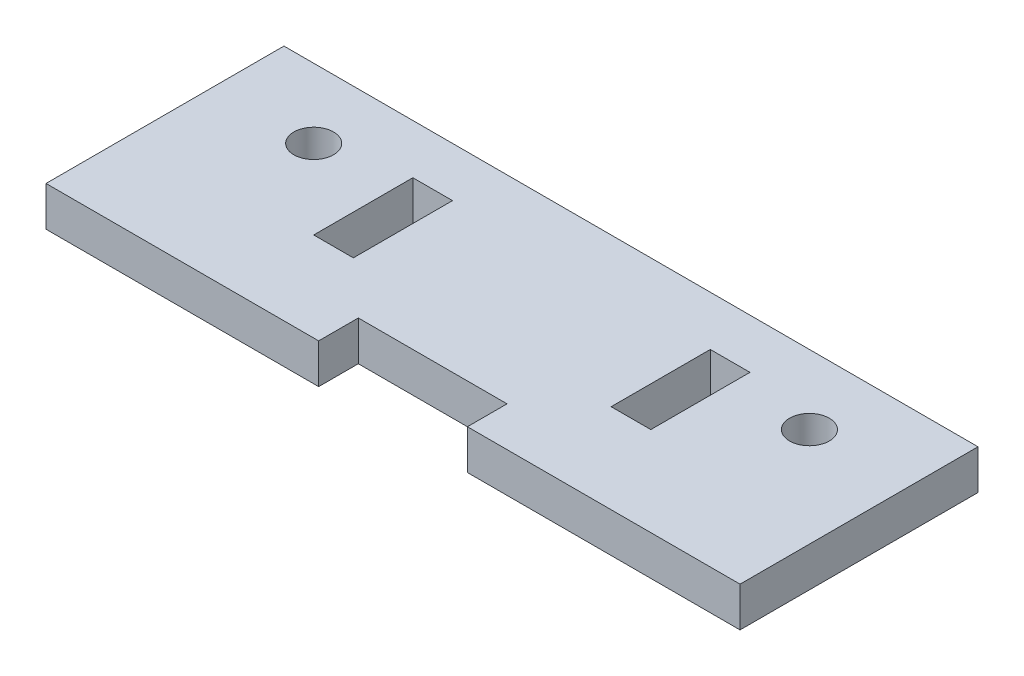
ISO-10303-21;
HEADER;
FILE_DESCRIPTION(('STEP AP214'),'2;1');
FILE_NAME('part.step','',(''),(''),'','','');
FILE_SCHEMA(('AUTOMOTIVE_DESIGN { 1 0 10303 214 1 1 1 1 }'));
ENDSEC;
DATA;
#1=APPLICATION_CONTEXT('core data for automotive mechanical design processes');
#2=APPLICATION_PROTOCOL_DEFINITION('international standard','automotive_design',2000,#1);
#3=PRODUCT_CONTEXT('',#1,'mechanical');
#4=PRODUCT('Part','Part','',(#3));
#5=PRODUCT_RELATED_PRODUCT_CATEGORY('part','',(#4));
#6=PRODUCT_DEFINITION_FORMATION('','',#4);
#7=PRODUCT_DEFINITION_CONTEXT('part definition',#1,'design');
#8=PRODUCT_DEFINITION('design','',#6,#7);
#9=PRODUCT_DEFINITION_SHAPE('','',#8);
#10=(LENGTH_UNIT() NAMED_UNIT(*) SI_UNIT(.MILLI.,.METRE.));
#11=(NAMED_UNIT(*) PLANE_ANGLE_UNIT() SI_UNIT($,.RADIAN.));
#12=(NAMED_UNIT(*) SI_UNIT($,.STERADIAN.) SOLID_ANGLE_UNIT());
#13=UNCERTAINTY_MEASURE_WITH_UNIT(LENGTH_MEASURE(1.E-05),#10,'distance_accuracy_value','');
#14=(GEOMETRIC_REPRESENTATION_CONTEXT(3) GLOBAL_UNCERTAINTY_ASSIGNED_CONTEXT((#13)) GLOBAL_UNIT_ASSIGNED_CONTEXT((#10,
#11,#12)) REPRESENTATION_CONTEXT('',''));
#15=CARTESIAN_POINT('',(0.,0.,0.));
#16=DIRECTION('',(0.,0.,1.));
#17=DIRECTION('',(1.,0.,0.));
#18=AXIS2_PLACEMENT_3D('',#15,#16,#17);
#19=CARTESIAN_POINT('',(0.,4.,0.));
#20=DIRECTION('',(0.,-1.,0.));
#21=DIRECTION('',(0.,0.,-1.));
#22=AXIS2_PLACEMENT_3D('',#19,#20,#21);
#23=PLANE('',#22);
#24=DIRECTION('',(0.,0.,1.));
#25=VECTOR('',#24,1.);
#26=CARTESIAN_POINT('',(18.,4.,-19.));
#27=LINE('',#26,#25);
#28=CARTESIAN_POINT('',(18.,4.,-19.));
#29=VERTEX_POINT('',#28);
#30=CARTESIAN_POINT('',(18.,4.,-9.));
#31=VERTEX_POINT('',#30);
#32=EDGE_CURVE('E210',#29,#31,#27,.T.);
#33=ORIENTED_EDGE('',*,*,#32,.F.);
#34=DIRECTION('',(-1.,0.,0.));
#35=VECTOR('',#34,1.);
#36=CARTESIAN_POINT('',(18.,4.,-19.));
#37=LINE('',#36,#35);
#38=CARTESIAN_POINT('',(22.,4.,-19.));
#39=VERTEX_POINT('',#38);
#40=EDGE_CURVE('E221',#39,#29,#37,.T.);
#41=ORIENTED_EDGE('',*,*,#40,.F.);
#42=DIRECTION('',(0.,0.,-1.));
#43=VECTOR('',#42,1.);
#44=CARTESIAN_POINT('',(22.,4.,-19.));
#45=LINE('',#44,#43);
#46=CARTESIAN_POINT('',(22.,4.,-9.));
#47=VERTEX_POINT('',#46);
#48=EDGE_CURVE('E217',#47,#39,#45,.T.);
#49=ORIENTED_EDGE('',*,*,#48,.F.);
#50=DIRECTION('',(1.,0.,0.));
#51=VECTOR('',#50,1.);
#52=CARTESIAN_POINT('',(18.,4.,-9.));
#53=LINE('',#52,#51);
#54=EDGE_CURVE('E213',#31,#47,#53,.T.);
#55=ORIENTED_EDGE('',*,*,#54,.F.);
#56=EDGE_LOOP('',(#33,#41,#49,#55));
#57=FACE_BOUND('',#56,.T.);
#58=DIRECTION('',(0.,0.,1.));
#59=VECTOR('',#58,1.);
#60=CARTESIAN_POINT('',(0.,4.,0.));
#61=LINE('',#60,#59);
#62=CARTESIAN_POINT('',(0.,4.,-24.));
#63=VERTEX_POINT('',#62);
#64=CARTESIAN_POINT('',(0.,4.,0.));
#65=VERTEX_POINT('',#64);
#66=EDGE_CURVE('E253',#63,#65,#61,.T.);
#67=ORIENTED_EDGE('',*,*,#66,.T.);
#68=DIRECTION('',(1.,0.,0.));
#69=VECTOR('',#68,1.);
#70=CARTESIAN_POINT('',(0.,4.,0.));
#71=LINE('',#70,#69);
#72=CARTESIAN_POINT('',(27.5,4.,0.));
#73=VERTEX_POINT('',#72);
#74=EDGE_CURVE('E257',#65,#73,#71,.T.);
#75=ORIENTED_EDGE('',*,*,#74,.T.);
#76=DIRECTION('',(0.,0.,-1.));
#77=VECTOR('',#76,1.);
#78=CARTESIAN_POINT('',(27.5,4.,0.));
#79=LINE('',#78,#77);
#80=CARTESIAN_POINT('',(27.5,4.,-4.));
#81=VERTEX_POINT('',#80);
#82=EDGE_CURVE('E261',#73,#81,#79,.T.);
#83=ORIENTED_EDGE('',*,*,#82,.T.);
#84=DIRECTION('',(1.,0.,0.));
#85=VECTOR('',#84,1.);
#86=CARTESIAN_POINT('',(27.5,4.,-4.));
#87=LINE('',#86,#85);
#88=CARTESIAN_POINT('',(42.5,4.,-4.));
#89=VERTEX_POINT('',#88);
#90=EDGE_CURVE('E264',#81,#89,#87,.T.);
#91=ORIENTED_EDGE('',*,*,#90,.T.);
#92=DIRECTION('',(0.,0.,1.));
#93=VECTOR('',#92,1.);
#94=CARTESIAN_POINT('',(42.5,4.,0.));
#95=LINE('',#94,#93);
#96=CARTESIAN_POINT('',(42.5,4.,0.));
#97=VERTEX_POINT('',#96);
#98=EDGE_CURVE('E267',#89,#97,#95,.T.);
#99=ORIENTED_EDGE('',*,*,#98,.T.);
#100=DIRECTION('',(1.,0.,0.));
#101=VECTOR('',#100,1.);
#102=CARTESIAN_POINT('',(42.5,4.,0.));
#103=LINE('',#102,#101);
#104=CARTESIAN_POINT('',(70.,4.,0.));
#105=VERTEX_POINT('',#104);
#106=EDGE_CURVE('E270',#97,#105,#103,.T.);
#107=ORIENTED_EDGE('',*,*,#106,.T.);
#108=DIRECTION('',(0.,0.,-1.));
#109=VECTOR('',#108,1.);
#110=CARTESIAN_POINT('',(70.,4.,0.));
#111=LINE('',#110,#109);
#112=CARTESIAN_POINT('',(70.,4.,-24.));
#113=VERTEX_POINT('',#112);
#114=EDGE_CURVE('E273',#105,#113,#111,.T.);
#115=ORIENTED_EDGE('',*,*,#114,.T.);
#116=DIRECTION('',(-1.,0.,0.));
#117=VECTOR('',#116,1.);
#118=CARTESIAN_POINT('',(0.,4.,-24.));
#119=LINE('',#118,#117);
#120=EDGE_CURVE('E276',#113,#63,#119,.T.);
#121=ORIENTED_EDGE('',*,*,#120,.T.);
#122=EDGE_LOOP('',(#67,#75,#83,#91,#99,#107,#115,#121));
#123=FACE_BOUND('',#122,.T.);
#124=DIRECTION('',(0.,0.,-1.));
#125=VECTOR('',#124,1.);
#126=CARTESIAN_POINT('',(52.,4.,-19.));
#127=LINE('',#126,#125);
#128=CARTESIAN_POINT('',(52.,4.,-9.));
#129=VERTEX_POINT('',#128);
#130=CARTESIAN_POINT('',(52.,4.,-19.));
#131=VERTEX_POINT('',#130);
#132=EDGE_CURVE('E159',#129,#131,#127,.T.);
#133=ORIENTED_EDGE('',*,*,#132,.F.);
#134=DIRECTION('',(1.,0.,0.));
#135=VECTOR('',#134,1.);
#136=CARTESIAN_POINT('',(52.,4.,-9.));
#137=LINE('',#136,#135);
#138=CARTESIAN_POINT('',(48.,4.,-9.));
#139=VERTEX_POINT('',#138);
#140=EDGE_CURVE('E186',#139,#129,#137,.T.);
#141=ORIENTED_EDGE('',*,*,#140,.F.);
#142=DIRECTION('',(0.,0.,1.));
#143=VECTOR('',#142,1.);
#144=CARTESIAN_POINT('',(48.,4.,-19.));
#145=LINE('',#144,#143);
#146=CARTESIAN_POINT('',(48.,4.,-19.));
#147=VERTEX_POINT('',#146);
#148=EDGE_CURVE('E182',#147,#139,#145,.T.);
#149=ORIENTED_EDGE('',*,*,#148,.F.);
#150=DIRECTION('',(-1.,0.,0.));
#151=VECTOR('',#150,1.);
#152=CARTESIAN_POINT('',(52.,4.,-19.));
#153=LINE('',#152,#151);
#154=EDGE_CURVE('E168',#131,#147,#153,.T.);
#155=ORIENTED_EDGE('',*,*,#154,.F.);
#156=EDGE_LOOP('',(#133,#141,#149,#155));
#157=FACE_BOUND('',#156,.T.);
#158=CARTESIAN_POINT('',(10.,4.,-17.));
#159=DIRECTION('',(0.,1.,0.));
#160=DIRECTION('',(0.,0.,1.));
#161=AXIS2_PLACEMENT_3D('',#158,#159,#160);
#162=CIRCLE('',#161,2.);
#163=CARTESIAN_POINT('',(10.,4.,-15.));
#164=VERTEX_POINT('',#163);
#165=EDGE_CURVE('E194',#164,#164,#162,.T.);
#166=ORIENTED_EDGE('',*,*,#165,.F.);
#167=EDGE_LOOP('',(#166));
#168=FACE_BOUND('',#167,.T.);
#169=CARTESIAN_POINT('',(60.,4.,-17.));
#170=DIRECTION('',(0.,1.,0.));
#171=DIRECTION('',(0.,0.,-1.));
#172=AXIS2_PLACEMENT_3D('',#169,#170,#171);
#173=CIRCLE('',#172,2.);
#174=CARTESIAN_POINT('',(60.,4.,-19.));
#175=VERTEX_POINT('',#174);
#176=EDGE_CURVE('E442',#175,#175,#173,.T.);
#177=ORIENTED_EDGE('',*,*,#176,.F.);
#178=EDGE_LOOP('',(#177));
#179=FACE_BOUND('',#178,.T.);
#180=ADVANCED_FACE('F45',(#57,#123,#157,#168,#179),#23,.F.);
#181=CARTESIAN_POINT('',(0.,0.,0.));
#182=DIRECTION('',(0.,-1.,0.));
#183=DIRECTION('',(0.,0.,-1.));
#184=AXIS2_PLACEMENT_3D('',#181,#182,#183);
#185=PLANE('',#184);
#186=CARTESIAN_POINT('',(10.,0.,-17.));
#187=DIRECTION('',(0.,1.,0.));
#188=DIRECTION('',(0.,0.,1.));
#189=AXIS2_PLACEMENT_3D('',#186,#187,#188);
#190=CIRCLE('',#189,2.);
#191=CARTESIAN_POINT('',(10.,0.,-15.));
#192=VERTEX_POINT('',#191);
#193=EDGE_CURVE('E450',#192,#192,#190,.T.);
#194=ORIENTED_EDGE('',*,*,#193,.T.);
#195=EDGE_LOOP('',(#194));
#196=FACE_BOUND('',#195,.T.);
#197=DIRECTION('',(0.,0.,1.));
#198=VECTOR('',#197,1.);
#199=CARTESIAN_POINT('',(0.,0.,0.));
#200=LINE('',#199,#198);
#201=CARTESIAN_POINT('',(0.,0.,-24.));
#202=VERTEX_POINT('',#201);
#203=CARTESIAN_POINT('',(0.,0.,0.));
#204=VERTEX_POINT('',#203);
#205=EDGE_CURVE('E252',#202,#204,#200,.T.);
#206=ORIENTED_EDGE('',*,*,#205,.F.);
#207=DIRECTION('',(-1.,0.,0.));
#208=VECTOR('',#207,1.);
#209=CARTESIAN_POINT('',(0.,0.,-24.));
#210=LINE('',#209,#208);
#211=CARTESIAN_POINT('',(70.,0.,-24.));
#212=VERTEX_POINT('',#211);
#213=EDGE_CURVE('E258',#212,#202,#210,.T.);
#214=ORIENTED_EDGE('',*,*,#213,.F.);
#215=DIRECTION('',(0.,0.,-1.));
#216=VECTOR('',#215,1.);
#217=CARTESIAN_POINT('',(70.,0.,0.));
#218=LINE('',#217,#216);
#219=CARTESIAN_POINT('',(70.,0.,0.));
#220=VERTEX_POINT('',#219);
#221=EDGE_CURVE('E299',#220,#212,#218,.T.);
#222=ORIENTED_EDGE('',*,*,#221,.F.);
#223=DIRECTION('',(1.,0.,0.));
#224=VECTOR('',#223,1.);
#225=CARTESIAN_POINT('',(50.,0.,0.));
#226=LINE('',#225,#224);
#227=CARTESIAN_POINT('',(42.5,0.,0.));
#228=VERTEX_POINT('',#227);
#229=EDGE_CURVE('E296',#228,#220,#226,.T.);
#230=ORIENTED_EDGE('',*,*,#229,.F.);
#231=DIRECTION('',(0.,0.,1.));
#232=VECTOR('',#231,1.);
#233=CARTESIAN_POINT('',(42.5,0.,0.));
#234=LINE('',#233,#232);
#235=CARTESIAN_POINT('',(42.5,0.,-4.));
#236=VERTEX_POINT('',#235);
#237=EDGE_CURVE('E292',#236,#228,#234,.T.);
#238=ORIENTED_EDGE('',*,*,#237,.F.);
#239=DIRECTION('',(1.,0.,0.));
#240=VECTOR('',#239,1.);
#241=CARTESIAN_POINT('',(27.5,0.,-4.));
#242=LINE('',#241,#240);
#243=CARTESIAN_POINT('',(27.5,0.,-4.));
#244=VERTEX_POINT('',#243);
#245=EDGE_CURVE('E289',#244,#236,#242,.T.);
#246=ORIENTED_EDGE('',*,*,#245,.F.);
#247=DIRECTION('',(0.,0.,-1.));
#248=VECTOR('',#247,1.);
#249=CARTESIAN_POINT('',(27.5,0.,0.));
#250=LINE('',#249,#248);
#251=CARTESIAN_POINT('',(27.5,0.,0.));
#252=VERTEX_POINT('',#251);
#253=EDGE_CURVE('E286',#252,#244,#250,.T.);
#254=ORIENTED_EDGE('',*,*,#253,.F.);
#255=DIRECTION('',(1.,0.,0.));
#256=VECTOR('',#255,1.);
#257=CARTESIAN_POINT('',(20.,0.,0.));
#258=LINE('',#257,#256);
#259=EDGE_CURVE('E283',#204,#252,#258,.T.);
#260=ORIENTED_EDGE('',*,*,#259,.F.);
#261=EDGE_LOOP('',(#206,#214,#222,#230,#238,#246,#254,#260));
#262=FACE_BOUND('',#261,.T.);
#263=DIRECTION('',(-1.,0.,0.));
#264=VECTOR('',#263,1.);
#265=CARTESIAN_POINT('',(18.,0.,-19.));
#266=LINE('',#265,#264);
#267=CARTESIAN_POINT('',(22.,0.,-19.));
#268=VERTEX_POINT('',#267);
#269=CARTESIAN_POINT('',(18.,0.,-19.));
#270=VERTEX_POINT('',#269);
#271=EDGE_CURVE('E214',#268,#270,#266,.T.);
#272=ORIENTED_EDGE('',*,*,#271,.T.);
#273=DIRECTION('',(0.,0.,1.));
#274=VECTOR('',#273,1.);
#275=CARTESIAN_POINT('',(18.,0.,-19.));
#276=LINE('',#275,#274);
#277=CARTESIAN_POINT('',(18.,0.,-9.));
#278=VERTEX_POINT('',#277);
#279=EDGE_CURVE('E177',#270,#278,#276,.T.);
#280=ORIENTED_EDGE('',*,*,#279,.T.);
#281=DIRECTION('',(1.,0.,0.));
#282=VECTOR('',#281,1.);
#283=CARTESIAN_POINT('',(18.,0.,-9.));
#284=LINE('',#283,#282);
#285=CARTESIAN_POINT('',(22.,0.,-9.));
#286=VERTEX_POINT('',#285);
#287=EDGE_CURVE('E228',#278,#286,#284,.T.);
#288=ORIENTED_EDGE('',*,*,#287,.T.);
#289=DIRECTION('',(0.,0.,-1.));
#290=VECTOR('',#289,1.);
#291=CARTESIAN_POINT('',(22.,0.,-19.));
#292=LINE('',#291,#290);
#293=EDGE_CURVE('E232',#286,#268,#292,.T.);
#294=ORIENTED_EDGE('',*,*,#293,.T.);
#295=EDGE_LOOP('',(#272,#280,#288,#294));
#296=FACE_BOUND('',#295,.T.);
#297=DIRECTION('',(1.,0.,0.));
#298=VECTOR('',#297,1.);
#299=CARTESIAN_POINT('',(52.,0.,-9.));
#300=LINE('',#299,#298);
#301=CARTESIAN_POINT('',(48.,0.,-9.));
#302=VERTEX_POINT('',#301);
#303=CARTESIAN_POINT('',(52.,0.,-9.));
#304=VERTEX_POINT('',#303);
#305=EDGE_CURVE('E169',#302,#304,#300,.T.);
#306=ORIENTED_EDGE('',*,*,#305,.T.);
#307=DIRECTION('',(0.,0.,-1.));
#308=VECTOR('',#307,1.);
#309=CARTESIAN_POINT('',(52.,0.,-19.));
#310=LINE('',#309,#308);
#311=CARTESIAN_POINT('',(52.,0.,-19.));
#312=VERTEX_POINT('',#311);
#313=EDGE_CURVE('E69',#304,#312,#310,.T.);
#314=ORIENTED_EDGE('',*,*,#313,.T.);
#315=DIRECTION('',(-1.,0.,0.));
#316=VECTOR('',#315,1.);
#317=CARTESIAN_POINT('',(52.,0.,-19.));
#318=LINE('',#317,#316);
#319=CARTESIAN_POINT('',(48.,0.,-19.));
#320=VERTEX_POINT('',#319);
#321=EDGE_CURVE('E175',#312,#320,#318,.T.);
#322=ORIENTED_EDGE('',*,*,#321,.T.);
#323=DIRECTION('',(0.,0.,1.));
#324=VECTOR('',#323,1.);
#325=CARTESIAN_POINT('',(48.,0.,-19.));
#326=LINE('',#325,#324);
#327=EDGE_CURVE('E197',#320,#302,#326,.T.);
#328=ORIENTED_EDGE('',*,*,#327,.T.);
#329=EDGE_LOOP('',(#306,#314,#322,#328));
#330=FACE_BOUND('',#329,.T.);
#331=CARTESIAN_POINT('',(60.,0.,-17.));
#332=DIRECTION('',(0.,1.,0.));
#333=DIRECTION('',(0.,0.,-1.));
#334=AXIS2_PLACEMENT_3D('',#331,#332,#333);
#335=CIRCLE('',#334,2.);
#336=CARTESIAN_POINT('',(60.,0.,-19.));
#337=VERTEX_POINT('',#336);
#338=EDGE_CURVE('E445',#337,#337,#335,.T.);
#339=ORIENTED_EDGE('',*,*,#338,.T.);
#340=EDGE_LOOP('',(#339));
#341=FACE_BOUND('',#340,.T.);
#342=ADVANCED_FACE('F338',(#196,#262,#296,#330,#341),#185,.T.);
#343=CARTESIAN_POINT('',(0.,4.,0.));
#344=DIRECTION('',(1.,0.,0.));
#345=DIRECTION('',(0.,0.,-1.));
#346=AXIS2_PLACEMENT_3D('',#343,#344,#345);
#347=PLANE('',#346);
#348=ORIENTED_EDGE('',*,*,#205,.T.);
#349=DIRECTION('',(0.,-1.,0.));
#350=VECTOR('',#349,1.);
#351=CARTESIAN_POINT('',(0.,4.,0.));
#352=LINE('',#351,#350);
#353=EDGE_CURVE('E11',#65,#204,#352,.T.);
#354=ORIENTED_EDGE('',*,*,#353,.F.);
#355=ORIENTED_EDGE('',*,*,#66,.F.);
#356=DIRECTION('',(0.,-1.,0.));
#357=VECTOR('',#356,1.);
#358=CARTESIAN_POINT('',(0.,4.,-24.));
#359=LINE('',#358,#357);
#360=EDGE_CURVE('E279',#63,#202,#359,.T.);
#361=ORIENTED_EDGE('',*,*,#360,.T.);
#362=EDGE_LOOP('',(#348,#354,#355,#361));
#363=FACE_BOUND('',#362,.T.);
#364=ADVANCED_FACE('F47',(#363),#347,.F.);
#365=CARTESIAN_POINT('',(20.,4.,0.));
#366=DIRECTION('',(0.,0.,-1.));
#367=DIRECTION('',(-1.,0.,0.));
#368=AXIS2_PLACEMENT_3D('',#365,#366,#367);
#369=PLANE('',#368);
#370=ORIENTED_EDGE('',*,*,#259,.T.);
#371=DIRECTION('',(0.,-1.,0.));
#372=VECTOR('',#371,1.);
#373=CARTESIAN_POINT('',(27.5,4.,0.));
#374=LINE('',#373,#372);
#375=EDGE_CURVE('E54',#73,#252,#374,.T.);
#376=ORIENTED_EDGE('',*,*,#375,.F.);
#377=ORIENTED_EDGE('',*,*,#74,.F.);
#378=ORIENTED_EDGE('',*,*,#353,.T.);
#379=EDGE_LOOP('',(#370,#376,#377,#378));
#380=FACE_BOUND('',#379,.T.);
#381=ADVANCED_FACE('F354',(#380),#369,.F.);
#382=CARTESIAN_POINT('',(27.5,4.,0.));
#383=DIRECTION('',(-1.,0.,0.));
#384=DIRECTION('',(0.,0.,1.));
#385=AXIS2_PLACEMENT_3D('',#382,#383,#384);
#386=PLANE('',#385);
#387=ORIENTED_EDGE('',*,*,#253,.T.);
#388=DIRECTION('',(0.,-1.,0.));
#389=VECTOR('',#388,1.);
#390=CARTESIAN_POINT('',(27.5,4.,-4.));
#391=LINE('',#390,#389);
#392=EDGE_CURVE('E323',#81,#244,#391,.T.);
#393=ORIENTED_EDGE('',*,*,#392,.F.);
#394=ORIENTED_EDGE('',*,*,#82,.F.);
#395=ORIENTED_EDGE('',*,*,#375,.T.);
#396=EDGE_LOOP('',(#387,#393,#394,#395));
#397=FACE_BOUND('',#396,.T.);
#398=ADVANCED_FACE('F332',(#397),#386,.F.);
#399=CARTESIAN_POINT('',(27.5,4.,-4.));
#400=DIRECTION('',(0.,0.,-1.));
#401=DIRECTION('',(-1.,0.,0.));
#402=AXIS2_PLACEMENT_3D('',#399,#400,#401);
#403=PLANE('',#402);
#404=ORIENTED_EDGE('',*,*,#245,.T.);
#405=DIRECTION('',(0.,-1.,0.));
#406=VECTOR('',#405,1.);
#407=CARTESIAN_POINT('',(42.5,4.,-4.));
#408=LINE('',#407,#406);
#409=EDGE_CURVE('E319',#89,#236,#408,.T.);
#410=ORIENTED_EDGE('',*,*,#409,.F.);
#411=ORIENTED_EDGE('',*,*,#90,.F.);
#412=ORIENTED_EDGE('',*,*,#392,.T.);
#413=EDGE_LOOP('',(#404,#410,#411,#412));
#414=FACE_BOUND('',#413,.T.);
#415=ADVANCED_FACE('F343',(#414),#403,.F.);
#416=CARTESIAN_POINT('',(42.5,4.,0.));
#417=DIRECTION('',(1.,0.,0.));
#418=DIRECTION('',(0.,0.,-1.));
#419=AXIS2_PLACEMENT_3D('',#416,#417,#418);
#420=PLANE('',#419);
#421=ORIENTED_EDGE('',*,*,#237,.T.);
#422=DIRECTION('',(0.,-1.,0.));
#423=VECTOR('',#422,1.);
#424=CARTESIAN_POINT('',(42.5,4.,0.));
#425=LINE('',#424,#423);
#426=EDGE_CURVE('E315',#97,#228,#425,.T.);
#427=ORIENTED_EDGE('',*,*,#426,.F.);
#428=ORIENTED_EDGE('',*,*,#98,.F.);
#429=ORIENTED_EDGE('',*,*,#409,.T.);
#430=EDGE_LOOP('',(#421,#427,#428,#429));
#431=FACE_BOUND('',#430,.T.);
#432=ADVANCED_FACE('F347',(#431),#420,.F.);
#433=CARTESIAN_POINT('',(50.,4.,0.));
#434=DIRECTION('',(0.,0.,-1.));
#435=DIRECTION('',(-1.,0.,0.));
#436=AXIS2_PLACEMENT_3D('',#433,#434,#435);
#437=PLANE('',#436);
#438=ORIENTED_EDGE('',*,*,#229,.T.);
#439=DIRECTION('',(0.,-1.,0.));
#440=VECTOR('',#439,1.);
#441=CARTESIAN_POINT('',(70.,4.,0.));
#442=LINE('',#441,#440);
#443=EDGE_CURVE('E311',#105,#220,#442,.T.);
#444=ORIENTED_EDGE('',*,*,#443,.F.);
#445=ORIENTED_EDGE('',*,*,#106,.F.);
#446=ORIENTED_EDGE('',*,*,#426,.T.);
#447=EDGE_LOOP('',(#438,#444,#445,#446));
#448=FACE_BOUND('',#447,.T.);
#449=ADVANCED_FACE('F367',(#448),#437,.F.);
#450=CARTESIAN_POINT('',(70.,4.,0.));
#451=DIRECTION('',(-1.,0.,0.));
#452=DIRECTION('',(0.,0.,1.));
#453=AXIS2_PLACEMENT_3D('',#450,#451,#452);
#454=PLANE('',#453);
#455=ORIENTED_EDGE('',*,*,#221,.T.);
#456=DIRECTION('',(0.,-1.,0.));
#457=VECTOR('',#456,1.);
#458=CARTESIAN_POINT('',(70.,4.,-24.));
#459=LINE('',#458,#457);
#460=EDGE_CURVE('E307',#113,#212,#459,.T.);
#461=ORIENTED_EDGE('',*,*,#460,.F.);
#462=ORIENTED_EDGE('',*,*,#114,.F.);
#463=ORIENTED_EDGE('',*,*,#443,.T.);
#464=EDGE_LOOP('',(#455,#461,#462,#463));
#465=FACE_BOUND('',#464,.T.);
#466=ADVANCED_FACE('F365',(#465),#454,.F.);
#467=CARTESIAN_POINT('',(0.,4.,-24.));
#468=DIRECTION('',(0.,0.,1.));
#469=DIRECTION('',(1.,0.,0.));
#470=AXIS2_PLACEMENT_3D('',#467,#468,#469);
#471=PLANE('',#470);
#472=ORIENTED_EDGE('',*,*,#213,.T.);
#473=ORIENTED_EDGE('',*,*,#360,.F.);
#474=ORIENTED_EDGE('',*,*,#120,.F.);
#475=ORIENTED_EDGE('',*,*,#460,.T.);
#476=EDGE_LOOP('',(#472,#473,#474,#475));
#477=FACE_BOUND('',#476,.T.);
#478=ADVANCED_FACE('F360',(#477),#471,.F.);
#479=CARTESIAN_POINT('',(18.,4.,-19.));
#480=DIRECTION('',(1.,0.,0.));
#481=DIRECTION('',(0.,0.,-1.));
#482=AXIS2_PLACEMENT_3D('',#479,#480,#481);
#483=PLANE('',#482);
#484=ORIENTED_EDGE('',*,*,#279,.F.);
#485=DIRECTION('',(0.,-1.,0.));
#486=VECTOR('',#485,1.);
#487=CARTESIAN_POINT('',(18.,4.,-19.));
#488=LINE('',#487,#486);
#489=EDGE_CURVE('E224',#29,#270,#488,.T.);
#490=ORIENTED_EDGE('',*,*,#489,.F.);
#491=ORIENTED_EDGE('',*,*,#32,.T.);
#492=DIRECTION('',(0.,-1.,0.));
#493=VECTOR('',#492,1.);
#494=CARTESIAN_POINT('',(18.,4.,-9.));
#495=LINE('',#494,#493);
#496=EDGE_CURVE('E248',#31,#278,#495,.T.);
#497=ORIENTED_EDGE('',*,*,#496,.T.);
#498=EDGE_LOOP('',(#484,#490,#491,#497));
#499=FACE_BOUND('',#498,.T.);
#500=ADVANCED_FACE('F386',(#499),#483,.T.);
#501=CARTESIAN_POINT('',(18.,4.,-9.));
#502=DIRECTION('',(0.,0.,-1.));
#503=DIRECTION('',(-1.,0.,0.));
#504=AXIS2_PLACEMENT_3D('',#501,#502,#503);
#505=PLANE('',#504);
#506=ORIENTED_EDGE('',*,*,#287,.F.);
#507=ORIENTED_EDGE('',*,*,#496,.F.);
#508=ORIENTED_EDGE('',*,*,#54,.T.);
#509=DIRECTION('',(0.,-1.,0.));
#510=VECTOR('',#509,1.);
#511=CARTESIAN_POINT('',(22.,4.,-9.));
#512=LINE('',#511,#510);
#513=EDGE_CURVE('E245',#47,#286,#512,.T.);
#514=ORIENTED_EDGE('',*,*,#513,.T.);
#515=EDGE_LOOP('',(#506,#507,#508,#514));
#516=FACE_BOUND('',#515,.T.);
#517=ADVANCED_FACE('F393',(#516),#505,.T.);
#518=CARTESIAN_POINT('',(22.,4.,-19.));
#519=DIRECTION('',(-1.,0.,0.));
#520=DIRECTION('',(0.,0.,1.));
#521=AXIS2_PLACEMENT_3D('',#518,#519,#520);
#522=PLANE('',#521);
#523=ORIENTED_EDGE('',*,*,#293,.F.);
#524=ORIENTED_EDGE('',*,*,#513,.F.);
#525=ORIENTED_EDGE('',*,*,#48,.T.);
#526=DIRECTION('',(0.,-1.,0.));
#527=VECTOR('',#526,1.);
#528=CARTESIAN_POINT('',(22.,4.,-19.));
#529=LINE('',#528,#527);
#530=EDGE_CURVE('E242',#39,#268,#529,.T.);
#531=ORIENTED_EDGE('',*,*,#530,.T.);
#532=EDGE_LOOP('',(#523,#524,#525,#531));
#533=FACE_BOUND('',#532,.T.);
#534=ADVANCED_FACE('F398',(#533),#522,.T.);
#535=CARTESIAN_POINT('',(18.,4.,-19.));
#536=DIRECTION('',(0.,0.,1.));
#537=DIRECTION('',(1.,0.,0.));
#538=AXIS2_PLACEMENT_3D('',#535,#536,#537);
#539=PLANE('',#538);
#540=ORIENTED_EDGE('',*,*,#271,.F.);
#541=ORIENTED_EDGE('',*,*,#530,.F.);
#542=ORIENTED_EDGE('',*,*,#40,.T.);
#543=ORIENTED_EDGE('',*,*,#489,.T.);
#544=EDGE_LOOP('',(#540,#541,#542,#543));
#545=FACE_BOUND('',#544,.T.);
#546=ADVANCED_FACE('F404',(#545),#539,.T.);
#547=CARTESIAN_POINT('',(52.,4.,-19.));
#548=DIRECTION('',(-1.,0.,0.));
#549=DIRECTION('',(0.,0.,1.));
#550=AXIS2_PLACEMENT_3D('',#547,#548,#549);
#551=PLANE('',#550);
#552=ORIENTED_EDGE('',*,*,#313,.F.);
#553=DIRECTION('',(0.,-1.,0.));
#554=VECTOR('',#553,1.);
#555=CARTESIAN_POINT('',(52.,4.,-9.));
#556=LINE('',#555,#554);
#557=EDGE_CURVE('E163',#129,#304,#556,.T.);
#558=ORIENTED_EDGE('',*,*,#557,.F.);
#559=ORIENTED_EDGE('',*,*,#132,.T.);
#560=DIRECTION('',(0.,-1.,0.));
#561=VECTOR('',#560,1.);
#562=CARTESIAN_POINT('',(52.,4.,-19.));
#563=LINE('',#562,#561);
#564=EDGE_CURVE('E162',#131,#312,#563,.T.);
#565=ORIENTED_EDGE('',*,*,#564,.T.);
#566=EDGE_LOOP('',(#552,#558,#559,#565));
#567=FACE_BOUND('',#566,.T.);
#568=ADVANCED_FACE('F161',(#567),#551,.T.);
#569=CARTESIAN_POINT('',(52.,4.,-19.));
#570=DIRECTION('',(0.,0.,1.));
#571=DIRECTION('',(1.,0.,0.));
#572=AXIS2_PLACEMENT_3D('',#569,#570,#571);
#573=PLANE('',#572);
#574=ORIENTED_EDGE('',*,*,#321,.F.);
#575=ORIENTED_EDGE('',*,*,#564,.F.);
#576=ORIENTED_EDGE('',*,*,#154,.T.);
#577=DIRECTION('',(0.,-1.,0.));
#578=VECTOR('',#577,1.);
#579=CARTESIAN_POINT('',(48.,4.,-19.));
#580=LINE('',#579,#578);
#581=EDGE_CURVE('E178',#147,#320,#580,.T.);
#582=ORIENTED_EDGE('',*,*,#581,.T.);
#583=EDGE_LOOP('',(#574,#575,#576,#582));
#584=FACE_BOUND('',#583,.T.);
#585=ADVANCED_FACE('F172',(#584),#573,.T.);
#586=CARTESIAN_POINT('',(48.,4.,-19.));
#587=DIRECTION('',(1.,0.,0.));
#588=DIRECTION('',(0.,0.,-1.));
#589=AXIS2_PLACEMENT_3D('',#586,#587,#588);
#590=PLANE('',#589);
#591=ORIENTED_EDGE('',*,*,#327,.F.);
#592=ORIENTED_EDGE('',*,*,#581,.F.);
#593=ORIENTED_EDGE('',*,*,#148,.T.);
#594=DIRECTION('',(0.,-1.,0.));
#595=VECTOR('',#594,1.);
#596=CARTESIAN_POINT('',(48.,4.,-9.));
#597=LINE('',#596,#595);
#598=EDGE_CURVE('E61',#139,#302,#597,.T.);
#599=ORIENTED_EDGE('',*,*,#598,.T.);
#600=EDGE_LOOP('',(#591,#592,#593,#599));
#601=FACE_BOUND('',#600,.T.);
#602=ADVANCED_FACE('F423',(#601),#590,.T.);
#603=CARTESIAN_POINT('',(52.,4.,-9.));
#604=DIRECTION('',(0.,0.,-1.));
#605=DIRECTION('',(-1.,0.,0.));
#606=AXIS2_PLACEMENT_3D('',#603,#604,#605);
#607=PLANE('',#606);
#608=ORIENTED_EDGE('',*,*,#305,.F.);
#609=ORIENTED_EDGE('',*,*,#598,.F.);
#610=ORIENTED_EDGE('',*,*,#140,.T.);
#611=ORIENTED_EDGE('',*,*,#557,.T.);
#612=EDGE_LOOP('',(#608,#609,#610,#611));
#613=FACE_BOUND('',#612,.T.);
#614=ADVANCED_FACE('F426',(#613),#607,.T.);
#615=CARTESIAN_POINT('',(10.,4.,-17.));
#616=DIRECTION('',(0.,-1.,0.));
#617=DIRECTION('',(0.,0.,-1.));
#618=AXIS2_PLACEMENT_3D('',#615,#616,#617);
#619=CYLINDRICAL_SURFACE('',#618,2.);
#620=ORIENTED_EDGE('',*,*,#165,.T.);
#621=EDGE_LOOP('',(#620));
#622=FACE_BOUND('',#621,.T.);
#623=ORIENTED_EDGE('',*,*,#193,.F.);
#624=EDGE_LOOP('',(#623));
#625=FACE_BOUND('',#624,.T.);
#626=ADVANCED_FACE('F430',(#622,#625),#619,.F.);
#627=CARTESIAN_POINT('',(60.,4.,-17.));
#628=DIRECTION('',(0.,-1.,0.));
#629=DIRECTION('',(0.,0.,-1.));
#630=AXIS2_PLACEMENT_3D('',#627,#628,#629);
#631=CYLINDRICAL_SURFACE('',#630,2.);
#632=ORIENTED_EDGE('',*,*,#176,.T.);
#633=EDGE_LOOP('',(#632));
#634=FACE_BOUND('',#633,.T.);
#635=ORIENTED_EDGE('',*,*,#338,.F.);
#636=EDGE_LOOP('',(#635));
#637=FACE_BOUND('',#636,.T.);
#638=ADVANCED_FACE('F433',(#634,#637),#631,.F.);
#639=CLOSED_SHELL('',(#180,#342,#364,#381,#398,#415,#432,#449,#466,#478,#500,#517,#534,#546,
#568,#585,#602,#614,#626,#638));
#640=MANIFOLD_SOLID_BREP('B2',#639);
#641=ADVANCED_BREP_SHAPE_REPRESENTATION('',(#18,#640),#14);
#642=SHAPE_DEFINITION_REPRESENTATION(#9,#641);
ENDSEC;
END-ISO-10303-21;
